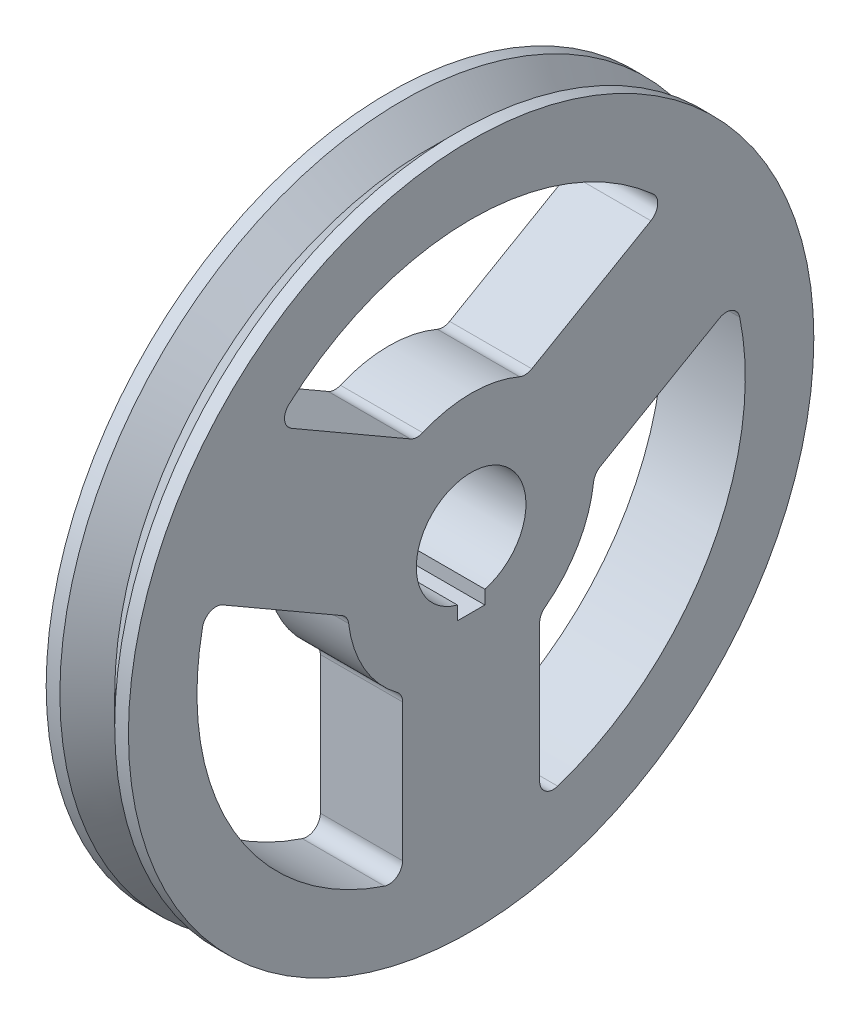
ISO-10303-21;
HEADER;
FILE_DESCRIPTION(('STEP AP214'),'2;1');
FILE_NAME('part.step','',(''),(''),'','','');
FILE_SCHEMA(('AUTOMOTIVE_DESIGN { 1 0 10303 214 1 1 1 1 }'));
ENDSEC;
DATA;
#1=APPLICATION_CONTEXT('core data for automotive mechanical design processes');
#2=APPLICATION_PROTOCOL_DEFINITION('international standard','automotive_design',2000,#1);
#3=PRODUCT_CONTEXT('',#1,'mechanical');
#4=PRODUCT('Part','Part','',(#3));
#5=PRODUCT_RELATED_PRODUCT_CATEGORY('part','',(#4));
#6=PRODUCT_DEFINITION_FORMATION('','',#4);
#7=PRODUCT_DEFINITION_CONTEXT('part definition',#1,'design');
#8=PRODUCT_DEFINITION('design','',#6,#7);
#9=PRODUCT_DEFINITION_SHAPE('','',#8);
#10=(LENGTH_UNIT() NAMED_UNIT(*) SI_UNIT(.MILLI.,.METRE.));
#11=(NAMED_UNIT(*) PLANE_ANGLE_UNIT() SI_UNIT($,.RADIAN.));
#12=(NAMED_UNIT(*) SI_UNIT($,.STERADIAN.) SOLID_ANGLE_UNIT());
#13=UNCERTAINTY_MEASURE_WITH_UNIT(LENGTH_MEASURE(1.E-05),#10,'distance_accuracy_value','');
#14=(GEOMETRIC_REPRESENTATION_CONTEXT(3) GLOBAL_UNCERTAINTY_ASSIGNED_CONTEXT((#13)) GLOBAL_UNIT_ASSIGNED_CONTEXT((#10,
#11,#12)) REPRESENTATION_CONTEXT('',''));
#15=CARTESIAN_POINT('',(0.,0.,0.));
#16=DIRECTION('',(0.,0.,1.));
#17=DIRECTION('',(1.,0.,0.));
#18=AXIS2_PLACEMENT_3D('',#15,#16,#17);
#19=CARTESIAN_POINT('',(-15.,0.,0.));
#20=DIRECTION('',(1.,0.,0.));
#21=DIRECTION('',(0.,0.,-1.));
#22=AXIS2_PLACEMENT_3D('',#19,#20,#21);
#23=PLANE('',#22);
#24=CARTESIAN_POINT('',(-15.,0.,0.));
#25=DIRECTION('',(-1.,0.,0.));
#26=DIRECTION('',(0.,0.,1.));
#27=AXIS2_PLACEMENT_3D('',#24,#25,#26);
#28=CIRCLE('',#27,125.);
#29=CARTESIAN_POINT('',(-15.,0.,125.));
#30=VERTEX_POINT('',#29);
#31=EDGE_CURVE('E49',#30,#30,#28,.T.);
#32=ORIENTED_EDGE('',*,*,#31,.T.);
#33=EDGE_LOOP('',(#32));
#34=FACE_BOUND('',#33,.T.);
#35=CARTESIAN_POINT('',(-15.,0.,0.));
#36=DIRECTION('',(-1.,0.,0.));
#37=DIRECTION('',(0.,0.,1.));
#38=AXIS2_PLACEMENT_3D('',#35,#36,#37);
#39=CIRCLE('',#38,100.);
#40=CARTESIAN_POINT('',(-15.,-94.8829283016839,31.5789473684211));
#41=VERTEX_POINT('',#40);
#42=CARTESIAN_POINT('',(-15.,20.0932935050176,97.9604999789263));
#43=VERTEX_POINT('',#42);
#44=EDGE_CURVE('E441',#41,#43,#39,.T.);
#45=ORIENTED_EDGE('',*,*,#44,.F.);
#46=CARTESIAN_POINT('',(-15.,-90.1387818865997,30.));
#47=DIRECTION('',(1.,0.,0.));
#48=DIRECTION('',(0.,0.,-1.));
#49=AXIS2_PLACEMENT_3D('',#46,#47,#48);
#50=CIRCLE('',#49,5.00000000000001);
#51=CARTESIAN_POINT('',(-15.,-90.1387818865997,25.));
#52=VERTEX_POINT('',#51);
#53=EDGE_CURVE('E336',#52,#41,#50,.F.);
#54=ORIENTED_EDGE('',*,*,#53,.F.);
#55=DIRECTION('',(0.,-1.,0.));
#56=VECTOR('',#55,1.);
#57=CARTESIAN_POINT('',(-15.,0.,25.));
#58=LINE('',#57,#56);
#59=CARTESIAN_POINT('',(-15.,-40.,25.));
#60=VERTEX_POINT('',#59);
#61=EDGE_CURVE('E334',#60,#52,#58,.T.);
#62=ORIENTED_EDGE('',*,*,#61,.F.);
#63=CARTESIAN_POINT('',(-15.,-40.,30.));
#64=DIRECTION('',(1.,0.,0.));
#65=DIRECTION('',(0.,0.,-1.));
#66=AXIS2_PLACEMENT_3D('',#63,#64,#65);
#67=CIRCLE('',#66,5.);
#68=CARTESIAN_POINT('',(-15.,-36.,27.));
#69=VERTEX_POINT('',#68);
#70=EDGE_CURVE('E332',#69,#60,#67,.F.);
#71=ORIENTED_EDGE('',*,*,#70,.F.);
#72=CARTESIAN_POINT('',(-15.,0.,0.));
#73=DIRECTION('',(-1.,0.,0.));
#74=DIRECTION('',(0.,0.,1.));
#75=AXIS2_PLACEMENT_3D('',#72,#73,#74);
#76=CIRCLE('',#75,45.);
#77=CARTESIAN_POINT('',(-15.,-5.3826859021805,44.6769145362397));
#78=VERTEX_POINT('',#77);
#79=EDGE_CURVE('E363',#69,#78,#76,.T.);
#80=ORIENTED_EDGE('',*,*,#79,.T.);
#81=CARTESIAN_POINT('',(-15.,-5.98076211353398,49.6410161513781));
#82=DIRECTION('',(1.,0.,0.));
#83=DIRECTION('',(0.,0.,-1.));
#84=AXIS2_PLACEMENT_3D('',#81,#82,#83);
#85=CIRCLE('',#84,5.00000000000096);
#86=CARTESIAN_POINT('',(-15.,-1.65063509461098,47.1410161513776));
#87=VERTEX_POINT('',#86);
#88=EDGE_CURVE('E399',#78,#87,#85,.T.);
#89=ORIENTED_EDGE('',*,*,#88,.T.);
#90=DIRECTION('',(0.,0.5,0.866025403784439));
#91=VECTOR('',#90,1.);
#92=CARTESIAN_POINT('',(-15.,-21.650635094611,12.5));
#93=LINE('',#92,#91);
#94=CARTESIAN_POINT('',(-15.,23.4187558486889,90.56247497998));
#95=VERTEX_POINT('',#94);
#96=EDGE_CURVE('E396',#87,#95,#93,.T.);
#97=ORIENTED_EDGE('',*,*,#96,.T.);
#98=CARTESIAN_POINT('',(-15.,19.0886288297667,93.06247497998));
#99=DIRECTION('',(1.,0.,0.));
#100=DIRECTION('',(0.,0.,-1.));
#101=AXIS2_PLACEMENT_3D('',#98,#99,#100);
#102=CIRCLE('',#101,5.00000000000001);
#103=EDGE_CURVE('E375',#95,#43,#102,.T.);
#104=ORIENTED_EDGE('',*,*,#103,.T.);
#105=EDGE_LOOP('',(#45,#54,#62,#71,#80,#89,#97,#104));
#106=FACE_BOUND('',#105,.T.);
#107=CARTESIAN_POINT('',(-15.,-90.1387818865997,-30.));
#108=DIRECTION('',(1.,0.,0.));
#109=DIRECTION('',(0.,0.,-1.));
#110=AXIS2_PLACEMENT_3D('',#107,#108,#109);
#111=CIRCLE('',#110,5.00000000000001);
#112=CARTESIAN_POINT('',(-15.,-90.1387818865997,-25.));
#113=VERTEX_POINT('',#112);
#114=CARTESIAN_POINT('',(-15.,-94.8829283016839,-31.5789473684211));
#115=VERTEX_POINT('',#114);
#116=EDGE_CURVE('E338',#113,#115,#111,.T.);
#117=ORIENTED_EDGE('',*,*,#116,.T.);
#118=CARTESIAN_POINT('',(-15.,20.0932935050176,-97.9604999789263));
#119=VERTEX_POINT('',#118);
#120=EDGE_CURVE('E445',#119,#115,#39,.T.);
#121=ORIENTED_EDGE('',*,*,#120,.F.);
#122=CARTESIAN_POINT('',(-15.,19.0886288297668,-93.06247497998));
#123=DIRECTION('',(1.,0.,0.));
#124=DIRECTION('',(0.,0.,-1.));
#125=AXIS2_PLACEMENT_3D('',#122,#123,#124);
#126=CIRCLE('',#125,5.00000000000001);
#127=CARTESIAN_POINT('',(-15.,23.4187558486889,-90.56247497998));
#128=VERTEX_POINT('',#127);
#129=EDGE_CURVE('E283',#128,#119,#126,.F.);
#130=ORIENTED_EDGE('',*,*,#129,.F.);
#131=DIRECTION('',(0.,0.5,-0.866025403784438));
#132=VECTOR('',#131,1.);
#133=CARTESIAN_POINT('',(-15.,-21.650635094611,-12.5));
#134=LINE('',#133,#132);
#135=CARTESIAN_POINT('',(-15.,-1.65063509461095,-47.1410161513776));
#136=VERTEX_POINT('',#135);
#137=EDGE_CURVE('E281',#136,#128,#134,.T.);
#138=ORIENTED_EDGE('',*,*,#137,.F.);
#139=CARTESIAN_POINT('',(-15.,-5.98076211353314,-49.6410161513776));
#140=DIRECTION('',(1.,0.,0.));
#141=DIRECTION('',(0.,0.,-1.));
#142=AXIS2_PLACEMENT_3D('',#139,#140,#141);
#143=CIRCLE('',#142,5.00000000000001);
#144=CARTESIAN_POINT('',(-15.,-5.38268590217982,-44.6769145362398));
#145=VERTEX_POINT('',#144);
#146=EDGE_CURVE('E260',#145,#136,#143,.F.);
#147=ORIENTED_EDGE('',*,*,#146,.F.);
#148=CARTESIAN_POINT('',(-15.,-36.,-27.));
#149=VERTEX_POINT('',#148);
#150=EDGE_CURVE('E64',#145,#149,#76,.T.);
#151=ORIENTED_EDGE('',*,*,#150,.T.);
#152=CARTESIAN_POINT('',(-15.,-40.,-30.));
#153=DIRECTION('',(1.,0.,0.));
#154=DIRECTION('',(0.,0.,-1.));
#155=AXIS2_PLACEMENT_3D('',#152,#153,#154);
#156=CIRCLE('',#155,5.);
#157=CARTESIAN_POINT('',(-15.,-40.,-25.));
#158=VERTEX_POINT('',#157);
#159=EDGE_CURVE('E311',#149,#158,#156,.T.);
#160=ORIENTED_EDGE('',*,*,#159,.T.);
#161=DIRECTION('',(0.,-1.,0.));
#162=VECTOR('',#161,1.);
#163=CARTESIAN_POINT('',(-15.,0.,-25.));
#164=LINE('',#163,#162);
#165=EDGE_CURVE('E316',#158,#113,#164,.T.);
#166=ORIENTED_EDGE('',*,*,#165,.T.);
#167=EDGE_LOOP('',(#117,#121,#130,#138,#147,#151,#160,#166));
#168=FACE_BOUND('',#167,.T.);
#169=CARTESIAN_POINT('',(-15.,41.3826859021799,17.6769145362398));
#170=VERTEX_POINT('',#169);
#171=CARTESIAN_POINT('',(-15.,41.3826859021799,-17.6769145362398));
#172=VERTEX_POINT('',#171);
#173=EDGE_CURVE('E364',#170,#172,#76,.T.);
#174=ORIENTED_EDGE('',*,*,#173,.T.);
#175=CARTESIAN_POINT('',(-15.,45.9807621135332,-19.6410161513775));
#176=DIRECTION('',(1.,0.,0.));
#177=DIRECTION('',(0.,0.,-1.));
#178=AXIS2_PLACEMENT_3D('',#175,#176,#177);
#179=CIRCLE('',#178,5.00000000000002);
#180=CARTESIAN_POINT('',(-15.,41.650635094611,-22.1410161513775));
#181=VERTEX_POINT('',#180);
#182=EDGE_CURVE('E266',#172,#181,#179,.T.);
#183=ORIENTED_EDGE('',*,*,#182,.T.);
#184=DIRECTION('',(0.,0.500000000000001,-0.866025403784438));
#185=VECTOR('',#184,1.);
#186=CARTESIAN_POINT('',(-15.,21.6506350946109,12.5));
#187=LINE('',#186,#185);
#188=CARTESIAN_POINT('',(-15.,66.7200260379109,-65.56247497998));
#189=VERTEX_POINT('',#188);
#190=EDGE_CURVE('E288',#181,#189,#187,.T.);
#191=ORIENTED_EDGE('',*,*,#190,.T.);
#192=CARTESIAN_POINT('',(-15.,71.0501530568331,-63.06247497998));
#193=DIRECTION('',(1.,0.,0.));
#194=DIRECTION('',(0.,0.,-1.));
#195=AXIS2_PLACEMENT_3D('',#192,#193,#194);
#196=CIRCLE('',#195,5.00000000000001);
#197=CARTESIAN_POINT('',(-15.,74.7896347966664,-66.3815526105052));
#198=VERTEX_POINT('',#197);
#199=EDGE_CURVE('E285',#189,#198,#196,.T.);
#200=ORIENTED_EDGE('',*,*,#199,.T.);
#201=CARTESIAN_POINT('',(-15.,74.7896347966663,66.3815526105053));
#202=VERTEX_POINT('',#201);
#203=EDGE_CURVE('E443',#202,#198,#39,.T.);
#204=ORIENTED_EDGE('',*,*,#203,.F.);
#205=CARTESIAN_POINT('',(-15.,71.050153056833,63.06247497998));
#206=DIRECTION('',(1.,0.,0.));
#207=DIRECTION('',(0.,0.,-1.));
#208=AXIS2_PLACEMENT_3D('',#205,#206,#207);
#209=CIRCLE('',#208,5.00000000000001);
#210=CARTESIAN_POINT('',(-15.,66.7200260379108,65.56247497998));
#211=VERTEX_POINT('',#210);
#212=EDGE_CURVE('E380',#211,#202,#209,.F.);
#213=ORIENTED_EDGE('',*,*,#212,.F.);
#214=DIRECTION('',(0.,0.5,0.866025403784439));
#215=VECTOR('',#214,1.);
#216=CARTESIAN_POINT('',(-15.,21.650635094611,-12.5));
#217=LINE('',#216,#215);
#218=CARTESIAN_POINT('',(-15.,41.650635094611,22.1410161513776));
#219=VERTEX_POINT('',#218);
#220=EDGE_CURVE('E404',#219,#211,#217,.T.);
#221=ORIENTED_EDGE('',*,*,#220,.F.);
#222=CARTESIAN_POINT('',(-15.,45.9807621135332,19.6410161513776));
#223=DIRECTION('',(1.,0.,0.));
#224=DIRECTION('',(0.,0.,-1.));
#225=AXIS2_PLACEMENT_3D('',#222,#223,#224);
#226=CIRCLE('',#225,5.00000000000001);
#227=EDGE_CURVE('E402',#170,#219,#226,.F.);
#228=ORIENTED_EDGE('',*,*,#227,.F.);
#229=EDGE_LOOP('',(#174,#183,#191,#200,#204,#213,#221,#228));
#230=FACE_BOUND('',#229,.T.);
#231=DIRECTION('',(0.,-1.,0.));
#232=VECTOR('',#231,1.);
#233=CARTESIAN_POINT('',(-15.,0.,5.));
#234=LINE('',#233,#232);
#235=CARTESIAN_POINT('',(-15.,-19.3649167310371,5.));
#236=VERTEX_POINT('',#235);
#237=CARTESIAN_POINT('',(-15.,-24.3649167310371,5.));
#238=VERTEX_POINT('',#237);
#239=EDGE_CURVE('E248',#236,#238,#234,.T.);
#240=ORIENTED_EDGE('',*,*,#239,.T.);
#241=DIRECTION('',(0.,0.,-1.));
#242=VECTOR('',#241,1.);
#243=CARTESIAN_POINT('',(-15.,-24.3649167310371,0.));
#244=LINE('',#243,#242);
#245=CARTESIAN_POINT('',(-15.,-24.3649167310371,-5.));
#246=VERTEX_POINT('',#245);
#247=EDGE_CURVE('E251',#238,#246,#244,.T.);
#248=ORIENTED_EDGE('',*,*,#247,.T.);
#249=DIRECTION('',(0.,-1.,0.));
#250=VECTOR('',#249,1.);
#251=CARTESIAN_POINT('',(-15.,0.,-5.));
#252=LINE('',#251,#250);
#253=CARTESIAN_POINT('',(-15.,-19.3649167310371,-5.));
#254=VERTEX_POINT('',#253);
#255=EDGE_CURVE('E240',#254,#246,#252,.T.);
#256=ORIENTED_EDGE('',*,*,#255,.F.);
#257=CARTESIAN_POINT('',(-15.,0.,0.));
#258=DIRECTION('',(-1.,0.,0.));
#259=DIRECTION('',(0.,0.,1.));
#260=AXIS2_PLACEMENT_3D('',#257,#258,#259);
#261=CIRCLE('',#260,20.);
#262=EDGE_CURVE('E372',#236,#254,#261,.T.);
#263=ORIENTED_EDGE('',*,*,#262,.F.);
#264=EDGE_LOOP('',(#240,#248,#256,#263));
#265=FACE_BOUND('',#264,.T.);
#266=ADVANCED_FACE('F41',(#34,#106,#168,#230,#265),#23,.F.);
#267=CARTESIAN_POINT('',(15.,0.,0.));
#268=DIRECTION('',(-1.,0.,0.));
#269=DIRECTION('',(0.,0.,1.));
#270=AXIS2_PLACEMENT_3D('',#267,#268,#269);
#271=PLANE('',#270);
#272=CARTESIAN_POINT('',(15.,-90.1387818865997,30.));
#273=DIRECTION('',(1.,0.,0.));
#274=DIRECTION('',(0.,0.,-1.));
#275=AXIS2_PLACEMENT_3D('',#272,#273,#274);
#276=CIRCLE('',#275,5.00000000000001);
#277=CARTESIAN_POINT('',(15.,-90.1387818865997,25.));
#278=VERTEX_POINT('',#277);
#279=CARTESIAN_POINT('',(15.,-94.8829283016839,31.5789473684211));
#280=VERTEX_POINT('',#279);
#281=EDGE_CURVE('E320',#278,#280,#276,.F.);
#282=ORIENTED_EDGE('',*,*,#281,.T.);
#283=CARTESIAN_POINT('',(15.,0.,0.));
#284=DIRECTION('',(-1.,0.,0.));
#285=DIRECTION('',(0.,0.,1.));
#286=AXIS2_PLACEMENT_3D('',#283,#284,#285);
#287=CIRCLE('',#286,100.);
#288=CARTESIAN_POINT('',(15.,20.0932935050176,97.9604999789263));
#289=VERTEX_POINT('',#288);
#290=EDGE_CURVE('E437',#280,#289,#287,.T.);
#291=ORIENTED_EDGE('',*,*,#290,.T.);
#292=CARTESIAN_POINT('',(15.,19.0886288297667,93.06247497998));
#293=DIRECTION('',(1.,0.,0.));
#294=DIRECTION('',(0.,0.,-1.));
#295=AXIS2_PLACEMENT_3D('',#292,#293,#294);
#296=CIRCLE('',#295,5.00000000000001);
#297=CARTESIAN_POINT('',(15.,23.4187558486889,90.56247497998));
#298=VERTEX_POINT('',#297);
#299=EDGE_CURVE('E376',#298,#289,#296,.T.);
#300=ORIENTED_EDGE('',*,*,#299,.F.);
#301=DIRECTION('',(0.,0.5,0.866025403784439));
#302=VECTOR('',#301,1.);
#303=CARTESIAN_POINT('',(15.,-21.650635094611,12.5));
#304=LINE('',#303,#302);
#305=CARTESIAN_POINT('',(15.,-1.65063509461098,47.1410161513776));
#306=VERTEX_POINT('',#305);
#307=EDGE_CURVE('E379',#306,#298,#304,.T.);
#308=ORIENTED_EDGE('',*,*,#307,.F.);
#309=CARTESIAN_POINT('',(15.,-5.98076211353398,49.6410161513781));
#310=DIRECTION('',(1.,0.,0.));
#311=DIRECTION('',(0.,0.,-1.));
#312=AXIS2_PLACEMENT_3D('',#309,#310,#311);
#313=CIRCLE('',#312,5.00000000000096);
#314=CARTESIAN_POINT('',(15.,-5.3826859021805,44.6769145362397));
#315=VERTEX_POINT('',#314);
#316=EDGE_CURVE('E383',#315,#306,#313,.T.);
#317=ORIENTED_EDGE('',*,*,#316,.F.);
#318=CARTESIAN_POINT('',(15.,0.,0.));
#319=DIRECTION('',(-1.,0.,0.));
#320=DIRECTION('',(0.,0.,1.));
#321=AXIS2_PLACEMENT_3D('',#318,#319,#320);
#322=CIRCLE('',#321,45.);
#323=CARTESIAN_POINT('',(15.,-36.,27.));
#324=VERTEX_POINT('',#323);
#325=EDGE_CURVE('E367',#324,#315,#322,.T.);
#326=ORIENTED_EDGE('',*,*,#325,.F.);
#327=CARTESIAN_POINT('',(15.,-40.,30.));
#328=DIRECTION('',(1.,0.,0.));
#329=DIRECTION('',(0.,0.,-1.));
#330=AXIS2_PLACEMENT_3D('',#327,#328,#329);
#331=CIRCLE('',#330,5.);
#332=CARTESIAN_POINT('',(15.,-40.,25.));
#333=VERTEX_POINT('',#332);
#334=EDGE_CURVE('E315',#324,#333,#331,.F.);
#335=ORIENTED_EDGE('',*,*,#334,.T.);
#336=DIRECTION('',(0.,-1.,0.));
#337=VECTOR('',#336,1.);
#338=CARTESIAN_POINT('',(15.,0.,25.));
#339=LINE('',#338,#337);
#340=EDGE_CURVE('E318',#333,#278,#339,.T.);
#341=ORIENTED_EDGE('',*,*,#340,.T.);
#342=EDGE_LOOP('',(#282,#291,#300,#308,#317,#326,#335,#341));
#343=FACE_BOUND('',#342,.T.);
#344=CARTESIAN_POINT('',(15.,0.,0.));
#345=DIRECTION('',(-1.,0.,0.));
#346=DIRECTION('',(0.,0.,1.));
#347=AXIS2_PLACEMENT_3D('',#344,#345,#346);
#348=CIRCLE('',#347,125.);
#349=CARTESIAN_POINT('',(15.,0.,125.));
#350=VERTEX_POINT('',#349);
#351=EDGE_CURVE('E434',#350,#350,#348,.T.);
#352=ORIENTED_EDGE('',*,*,#351,.F.);
#353=EDGE_LOOP('',(#352));
#354=FACE_BOUND('',#353,.T.);
#355=CARTESIAN_POINT('',(15.,-5.38268590217982,-44.6769145362398));
#356=VERTEX_POINT('',#355);
#357=CARTESIAN_POINT('',(15.,-36.,-27.));
#358=VERTEX_POINT('',#357);
#359=EDGE_CURVE('E370',#356,#358,#322,.T.);
#360=ORIENTED_EDGE('',*,*,#359,.F.);
#361=CARTESIAN_POINT('',(15.,-5.98076211353314,-49.6410161513776));
#362=DIRECTION('',(1.,0.,0.));
#363=DIRECTION('',(0.,0.,-1.));
#364=AXIS2_PLACEMENT_3D('',#361,#362,#363);
#365=CIRCLE('',#364,5.00000000000001);
#366=CARTESIAN_POINT('',(15.,-1.65063509461095,-47.1410161513776));
#367=VERTEX_POINT('',#366);
#368=EDGE_CURVE('E263',#356,#367,#365,.F.);
#369=ORIENTED_EDGE('',*,*,#368,.T.);
#370=DIRECTION('',(0.,0.5,-0.866025403784438));
#371=VECTOR('',#370,1.);
#372=CARTESIAN_POINT('',(15.,-21.650635094611,-12.5));
#373=LINE('',#372,#371);
#374=CARTESIAN_POINT('',(15.,23.4187558486889,-90.56247497998));
#375=VERTEX_POINT('',#374);
#376=EDGE_CURVE('E265',#367,#375,#373,.T.);
#377=ORIENTED_EDGE('',*,*,#376,.T.);
#378=CARTESIAN_POINT('',(15.,19.0886288297668,-93.06247497998));
#379=DIRECTION('',(1.,0.,0.));
#380=DIRECTION('',(0.,0.,-1.));
#381=AXIS2_PLACEMENT_3D('',#378,#379,#380);
#382=CIRCLE('',#381,5.00000000000001);
#383=CARTESIAN_POINT('',(15.,20.0932935050176,-97.9604999789263));
#384=VERTEX_POINT('',#383);
#385=EDGE_CURVE('E268',#375,#384,#382,.F.);
#386=ORIENTED_EDGE('',*,*,#385,.T.);
#387=CARTESIAN_POINT('',(15.,-94.8829283016839,-31.5789473684211));
#388=VERTEX_POINT('',#387);
#389=EDGE_CURVE('E442',#384,#388,#287,.T.);
#390=ORIENTED_EDGE('',*,*,#389,.T.);
#391=CARTESIAN_POINT('',(15.,-90.1387818865997,-30.));
#392=DIRECTION('',(1.,0.,0.));
#393=DIRECTION('',(0.,0.,-1.));
#394=AXIS2_PLACEMENT_3D('',#391,#392,#393);
#395=CIRCLE('',#394,5.00000000000001);
#396=CARTESIAN_POINT('',(15.,-90.1387818865997,-25.));
#397=VERTEX_POINT('',#396);
#398=EDGE_CURVE('E323',#397,#388,#395,.T.);
#399=ORIENTED_EDGE('',*,*,#398,.F.);
#400=DIRECTION('',(0.,-1.,0.));
#401=VECTOR('',#400,1.);
#402=CARTESIAN_POINT('',(15.,0.,-25.));
#403=LINE('',#402,#401);
#404=CARTESIAN_POINT('',(15.,-40.,-25.));
#405=VERTEX_POINT('',#404);
#406=EDGE_CURVE('E326',#405,#397,#403,.T.);
#407=ORIENTED_EDGE('',*,*,#406,.F.);
#408=CARTESIAN_POINT('',(15.,-40.,-30.));
#409=DIRECTION('',(1.,0.,0.));
#410=DIRECTION('',(0.,0.,-1.));
#411=AXIS2_PLACEMENT_3D('',#408,#409,#410);
#412=CIRCLE('',#411,5.);
#413=EDGE_CURVE('E312',#358,#405,#412,.T.);
#414=ORIENTED_EDGE('',*,*,#413,.F.);
#415=EDGE_LOOP('',(#360,#369,#377,#386,#390,#399,#407,#414));
#416=FACE_BOUND('',#415,.T.);
#417=CARTESIAN_POINT('',(15.,45.9807621135332,-19.6410161513775));
#418=DIRECTION('',(1.,0.,0.));
#419=DIRECTION('',(0.,0.,-1.));
#420=AXIS2_PLACEMENT_3D('',#417,#418,#419);
#421=CIRCLE('',#420,5.00000000000002);
#422=CARTESIAN_POINT('',(15.,41.3826859021799,-17.6769145362398));
#423=VERTEX_POINT('',#422);
#424=CARTESIAN_POINT('',(15.,41.650635094611,-22.1410161513775));
#425=VERTEX_POINT('',#424);
#426=EDGE_CURVE('E276',#423,#425,#421,.T.);
#427=ORIENTED_EDGE('',*,*,#426,.F.);
#428=CARTESIAN_POINT('',(15.,41.3826859021798,17.6769145362398));
#429=VERTEX_POINT('',#428);
#430=EDGE_CURVE('E368',#429,#423,#322,.T.);
#431=ORIENTED_EDGE('',*,*,#430,.F.);
#432=CARTESIAN_POINT('',(15.,45.9807621135332,19.6410161513776));
#433=DIRECTION('',(1.,0.,0.));
#434=DIRECTION('',(0.,0.,-1.));
#435=AXIS2_PLACEMENT_3D('',#432,#433,#434);
#436=CIRCLE('',#435,5.00000000000001);
#437=CARTESIAN_POINT('',(15.,41.650635094611,22.1410161513776));
#438=VERTEX_POINT('',#437);
#439=EDGE_CURVE('E386',#429,#438,#436,.F.);
#440=ORIENTED_EDGE('',*,*,#439,.T.);
#441=DIRECTION('',(0.,0.5,0.866025403784439));
#442=VECTOR('',#441,1.);
#443=CARTESIAN_POINT('',(15.,21.650635094611,-12.5));
#444=LINE('',#443,#442);
#445=CARTESIAN_POINT('',(15.,66.7200260379108,65.56247497998));
#446=VERTEX_POINT('',#445);
#447=EDGE_CURVE('E388',#438,#446,#444,.T.);
#448=ORIENTED_EDGE('',*,*,#447,.T.);
#449=CARTESIAN_POINT('',(15.,71.050153056833,63.06247497998));
#450=DIRECTION('',(1.,0.,0.));
#451=DIRECTION('',(0.,0.,-1.));
#452=AXIS2_PLACEMENT_3D('',#449,#450,#451);
#453=CIRCLE('',#452,5.00000000000001);
#454=CARTESIAN_POINT('',(15.,74.7896347966663,66.3815526105053));
#455=VERTEX_POINT('',#454);
#456=EDGE_CURVE('E390',#446,#455,#453,.F.);
#457=ORIENTED_EDGE('',*,*,#456,.T.);
#458=CARTESIAN_POINT('',(15.,74.7896347966664,-66.3815526105052));
#459=VERTEX_POINT('',#458);
#460=EDGE_CURVE('E438',#455,#459,#287,.T.);
#461=ORIENTED_EDGE('',*,*,#460,.T.);
#462=CARTESIAN_POINT('',(15.,71.0501530568331,-63.06247497998));
#463=DIRECTION('',(1.,0.,0.));
#464=DIRECTION('',(0.,0.,-1.));
#465=AXIS2_PLACEMENT_3D('',#462,#463,#464);
#466=CIRCLE('',#465,5.00000000000001);
#467=CARTESIAN_POINT('',(15.,66.7200260379109,-65.56247497998));
#468=VERTEX_POINT('',#467);
#469=EDGE_CURVE('E271',#468,#459,#466,.T.);
#470=ORIENTED_EDGE('',*,*,#469,.F.);
#471=DIRECTION('',(0.,0.500000000000001,-0.866025403784438));
#472=VECTOR('',#471,1.);
#473=CARTESIAN_POINT('',(15.,21.6506350946109,12.5));
#474=LINE('',#473,#472);
#475=EDGE_CURVE('E273',#425,#468,#474,.T.);
#476=ORIENTED_EDGE('',*,*,#475,.F.);
#477=EDGE_LOOP('',(#427,#431,#440,#448,#457,#461,#470,#476));
#478=FACE_BOUND('',#477,.T.);
#479=DIRECTION('',(0.,-1.,0.));
#480=VECTOR('',#479,1.);
#481=CARTESIAN_POINT('',(15.,0.,5.));
#482=LINE('',#481,#480);
#483=CARTESIAN_POINT('',(15.,-19.3649167310371,5.));
#484=VERTEX_POINT('',#483);
#485=CARTESIAN_POINT('',(15.,-24.3649167310371,5.));
#486=VERTEX_POINT('',#485);
#487=EDGE_CURVE('E236',#484,#486,#482,.T.);
#488=ORIENTED_EDGE('',*,*,#487,.F.);
#489=CARTESIAN_POINT('',(15.,0.,0.));
#490=DIRECTION('',(-1.,0.,0.));
#491=DIRECTION('',(0.,0.,1.));
#492=AXIS2_PLACEMENT_3D('',#489,#490,#491);
#493=CIRCLE('',#492,20.);
#494=CARTESIAN_POINT('',(15.,-19.3649167310371,-5.));
#495=VERTEX_POINT('',#494);
#496=EDGE_CURVE('E247',#484,#495,#493,.T.);
#497=ORIENTED_EDGE('',*,*,#496,.T.);
#498=DIRECTION('',(0.,-1.,0.));
#499=VECTOR('',#498,1.);
#500=CARTESIAN_POINT('',(15.,0.,-5.));
#501=LINE('',#500,#499);
#502=CARTESIAN_POINT('',(15.,-24.3649167310371,-5.));
#503=VERTEX_POINT('',#502);
#504=EDGE_CURVE('E56',#495,#503,#501,.T.);
#505=ORIENTED_EDGE('',*,*,#504,.T.);
#506=DIRECTION('',(0.,0.,-1.));
#507=VECTOR('',#506,1.);
#508=CARTESIAN_POINT('',(15.,-24.3649167310371,0.));
#509=LINE('',#508,#507);
#510=EDGE_CURVE('E228',#486,#503,#509,.T.);
#511=ORIENTED_EDGE('',*,*,#510,.F.);
#512=EDGE_LOOP('',(#488,#497,#505,#511));
#513=FACE_BOUND('',#512,.T.);
#514=ADVANCED_FACE('F245',(#343,#354,#416,#478,#513),#271,.F.);
#515=CARTESIAN_POINT('',(0.,0.,0.));
#516=DIRECTION('',(-1.,0.,0.));
#517=DIRECTION('',(0.,0.,1.));
#518=AXIS2_PLACEMENT_3D('',#515,#516,#517);
#519=CYLINDRICAL_SURFACE('',#518,20.);
#520=DIRECTION('',(-1.,0.,0.));
#521=VECTOR('',#520,1.);
#522=CARTESIAN_POINT('',(15.,-19.3649167310371,5.));
#523=LINE('',#522,#521);
#524=EDGE_CURVE('E257',#484,#236,#523,.T.);
#525=ORIENTED_EDGE('',*,*,#524,.T.);
#526=ORIENTED_EDGE('',*,*,#262,.T.);
#527=DIRECTION('',(-1.,0.,0.));
#528=VECTOR('',#527,1.);
#529=CARTESIAN_POINT('',(15.,-19.3649167310371,-5.));
#530=LINE('',#529,#528);
#531=EDGE_CURVE('E242',#495,#254,#530,.T.);
#532=ORIENTED_EDGE('',*,*,#531,.F.);
#533=ORIENTED_EDGE('',*,*,#496,.F.);
#534=EDGE_LOOP('',(#525,#526,#532,#533));
#535=FACE_BOUND('',#534,.T.);
#536=ADVANCED_FACE('F476',(#535),#519,.F.);
#537=CARTESIAN_POINT('',(0.,0.,0.));
#538=DIRECTION('',(-1.,0.,0.));
#539=DIRECTION('',(0.,0.,1.));
#540=AXIS2_PLACEMENT_3D('',#537,#538,#539);
#541=CYLINDRICAL_SURFACE('',#540,100.);
#542=DIRECTION('',(-1.,0.,0.));
#543=VECTOR('',#542,1.);
#544=CARTESIAN_POINT('',(15.,74.7896347966664,-66.3815526105052));
#545=LINE('',#544,#543);
#546=EDGE_CURVE('E298',#459,#198,#545,.T.);
#547=ORIENTED_EDGE('',*,*,#546,.F.);
#548=ORIENTED_EDGE('',*,*,#460,.F.);
#549=DIRECTION('',(-1.,0.,0.));
#550=VECTOR('',#549,1.);
#551=CARTESIAN_POINT('',(15.,74.7896347966663,66.3815526105053));
#552=LINE('',#551,#550);
#553=EDGE_CURVE('E393',#455,#202,#552,.T.);
#554=ORIENTED_EDGE('',*,*,#553,.T.);
#555=ORIENTED_EDGE('',*,*,#203,.T.);
#556=EDGE_LOOP('',(#547,#548,#554,#555));
#557=FACE_BOUND('',#556,.T.);
#558=ADVANCED_FACE('F510',(#557),#541,.F.);
#559=CARTESIAN_POINT('',(0.,0.,0.));
#560=DIRECTION('',(-1.,0.,0.));
#561=DIRECTION('',(0.,0.,1.));
#562=AXIS2_PLACEMENT_3D('',#559,#560,#561);
#563=CYLINDRICAL_SURFACE('',#562,45.);
#564=ORIENTED_EDGE('',*,*,#430,.T.);
#565=DIRECTION('',(-1.,0.,0.));
#566=VECTOR('',#565,1.);
#567=CARTESIAN_POINT('',(15.,41.3826859021799,-17.6769145362398));
#568=LINE('',#567,#566);
#569=EDGE_CURVE('E279',#423,#172,#568,.T.);
#570=ORIENTED_EDGE('',*,*,#569,.T.);
#571=ORIENTED_EDGE('',*,*,#173,.F.);
#572=DIRECTION('',(-1.,0.,0.));
#573=VECTOR('',#572,1.);
#574=CARTESIAN_POINT('',(15.,41.3826859021799,17.6769145362398));
#575=LINE('',#574,#573);
#576=EDGE_CURVE('E415',#429,#170,#575,.T.);
#577=ORIENTED_EDGE('',*,*,#576,.F.);
#578=EDGE_LOOP('',(#564,#570,#571,#577));
#579=FACE_BOUND('',#578,.T.);
#580=ADVANCED_FACE('F492',(#579),#563,.T.);
#581=ORIENTED_EDGE('',*,*,#389,.F.);
#582=DIRECTION('',(-1.,0.,0.));
#583=VECTOR('',#582,1.);
#584=CARTESIAN_POINT('',(15.,20.0932935050176,-97.9604999789263));
#585=LINE('',#584,#583);
#586=EDGE_CURVE('E300',#384,#119,#585,.T.);
#587=ORIENTED_EDGE('',*,*,#586,.T.);
#588=ORIENTED_EDGE('',*,*,#120,.T.);
#589=DIRECTION('',(-1.,0.,0.));
#590=VECTOR('',#589,1.);
#591=CARTESIAN_POINT('',(15.,-94.8829283016839,-31.5789473684211));
#592=LINE('',#591,#590);
#593=EDGE_CURVE('E346',#388,#115,#592,.T.);
#594=ORIENTED_EDGE('',*,*,#593,.F.);
#595=EDGE_LOOP('',(#581,#587,#588,#594));
#596=FACE_BOUND('',#595,.T.);
#597=ADVANCED_FACE('F535',(#596),#541,.F.);
#598=DIRECTION('',(-1.,0.,0.));
#599=VECTOR('',#598,1.);
#600=CARTESIAN_POINT('',(15.,-5.38268590217982,-44.6769145362398));
#601=LINE('',#600,#599);
#602=EDGE_CURVE('E309',#356,#145,#601,.T.);
#603=ORIENTED_EDGE('',*,*,#602,.F.);
#604=ORIENTED_EDGE('',*,*,#359,.T.);
#605=DIRECTION('',(-1.,0.,0.));
#606=VECTOR('',#605,1.);
#607=CARTESIAN_POINT('',(15.,-36.,-27.));
#608=LINE('',#607,#606);
#609=EDGE_CURVE('E361',#358,#149,#608,.T.);
#610=ORIENTED_EDGE('',*,*,#609,.T.);
#611=ORIENTED_EDGE('',*,*,#150,.F.);
#612=EDGE_LOOP('',(#603,#604,#610,#611));
#613=FACE_BOUND('',#612,.T.);
#614=ADVANCED_FACE('F533',(#613),#563,.T.);
#615=ORIENTED_EDGE('',*,*,#290,.F.);
#616=DIRECTION('',(-1.,0.,0.));
#617=VECTOR('',#616,1.);
#618=CARTESIAN_POINT('',(15.,-94.8829283016839,31.5789473684211));
#619=LINE('',#618,#617);
#620=EDGE_CURVE('E349',#280,#41,#619,.T.);
#621=ORIENTED_EDGE('',*,*,#620,.T.);
#622=ORIENTED_EDGE('',*,*,#44,.T.);
#623=DIRECTION('',(-1.,0.,0.));
#624=VECTOR('',#623,1.);
#625=CARTESIAN_POINT('',(15.,20.0932935050176,97.9604999789263));
#626=LINE('',#625,#624);
#627=EDGE_CURVE('E425',#289,#43,#626,.T.);
#628=ORIENTED_EDGE('',*,*,#627,.F.);
#629=EDGE_LOOP('',(#615,#621,#622,#628));
#630=FACE_BOUND('',#629,.T.);
#631=ADVANCED_FACE('F459',(#630),#541,.F.);
#632=CARTESIAN_POINT('',(0.,0.,0.));
#633=DIRECTION('',(-1.,0.,0.));
#634=DIRECTION('',(0.,0.,1.));
#635=AXIS2_PLACEMENT_3D('',#632,#633,#634);
#636=CONICAL_SURFACE('',#635,115.,0.785398163397449);
#637=CARTESIAN_POINT('',(-9.99999999999998,0.,0.));
#638=DIRECTION('',(-1.,0.,0.));
#639=DIRECTION('',(0.,0.,1.));
#640=AXIS2_PLACEMENT_3D('',#637,#638,#639);
#641=CIRCLE('',#640,125.);
#642=CARTESIAN_POINT('',(-9.99999999999998,0.,125.));
#643=VERTEX_POINT('',#642);
#644=EDGE_CURVE('E11',#643,#643,#641,.T.);
#645=ORIENTED_EDGE('',*,*,#644,.F.);
#646=EDGE_LOOP('',(#645));
#647=FACE_BOUND('',#646,.T.);
#648=CARTESIAN_POINT('',(0.,0.,0.));
#649=DIRECTION('',(-1.,0.,0.));
#650=DIRECTION('',(0.,0.,1.));
#651=AXIS2_PLACEMENT_3D('',#648,#649,#650);
#652=CIRCLE('',#651,115.);
#653=CARTESIAN_POINT('',(0.,0.,115.));
#654=VERTEX_POINT('',#653);
#655=EDGE_CURVE('E428',#654,#654,#652,.T.);
#656=ORIENTED_EDGE('',*,*,#655,.T.);
#657=EDGE_LOOP('',(#656));
#658=FACE_BOUND('',#657,.T.);
#659=ADVANCED_FACE('F43',(#647,#658),#636,.T.);
#660=CARTESIAN_POINT('',(0.,0.,0.));
#661=DIRECTION('',(-1.,0.,0.));
#662=DIRECTION('',(0.,0.,1.));
#663=AXIS2_PLACEMENT_3D('',#660,#661,#662);
#664=CYLINDRICAL_SURFACE('',#663,125.);
#665=ORIENTED_EDGE('',*,*,#31,.F.);
#666=EDGE_LOOP('',(#665));
#667=FACE_BOUND('',#666,.T.);
#668=ORIENTED_EDGE('',*,*,#644,.T.);
#669=EDGE_LOOP('',(#668));
#670=FACE_BOUND('',#669,.T.);
#671=ADVANCED_FACE('F451',(#667,#670),#664,.T.);
#672=CARTESIAN_POINT('',(0.,0.,0.));
#673=DIRECTION('',(-1.,0.,0.));
#674=DIRECTION('',(0.,0.,1.));
#675=AXIS2_PLACEMENT_3D('',#672,#673,#674);
#676=CYLINDRICAL_SURFACE('',#675,125.);
#677=CARTESIAN_POINT('',(10.,0.,0.));
#678=DIRECTION('',(-1.,0.,0.));
#679=DIRECTION('',(0.,0.,1.));
#680=AXIS2_PLACEMENT_3D('',#677,#678,#679);
#681=CIRCLE('',#680,125.);
#682=CARTESIAN_POINT('',(10.,0.,125.));
#683=VERTEX_POINT('',#682);
#684=EDGE_CURVE('E431',#683,#683,#681,.T.);
#685=ORIENTED_EDGE('',*,*,#684,.F.);
#686=EDGE_LOOP('',(#685));
#687=FACE_BOUND('',#686,.T.);
#688=ORIENTED_EDGE('',*,*,#351,.T.);
#689=EDGE_LOOP('',(#688));
#690=FACE_BOUND('',#689,.T.);
#691=ADVANCED_FACE('F454',(#687,#690),#676,.T.);
#692=CARTESIAN_POINT('',(10.,0.,0.));
#693=DIRECTION('',(1.,0.,0.));
#694=DIRECTION('',(0.,0.,-1.));
#695=AXIS2_PLACEMENT_3D('',#692,#693,#694);
#696=CONICAL_SURFACE('',#695,125.,0.785398163397447);
#697=ORIENTED_EDGE('',*,*,#655,.F.);
#698=EDGE_LOOP('',(#697));
#699=FACE_BOUND('',#698,.T.);
#700=ORIENTED_EDGE('',*,*,#684,.T.);
#701=EDGE_LOOP('',(#700));
#702=FACE_BOUND('',#701,.T.);
#703=ADVANCED_FACE('F462',(#699,#702),#696,.T.);
#704=CARTESIAN_POINT('',(15.,19.0886288297667,93.06247497998));
#705=DIRECTION('',(-1.,0.,0.));
#706=DIRECTION('',(0.,0.,1.));
#707=AXIS2_PLACEMENT_3D('',#704,#705,#706);
#708=CYLINDRICAL_SURFACE('',#707,5.00000000000001);
#709=ORIENTED_EDGE('',*,*,#103,.F.);
#710=DIRECTION('',(-1.,0.,0.));
#711=VECTOR('',#710,1.);
#712=CARTESIAN_POINT('',(15.,23.4187558486889,90.56247497998));
#713=LINE('',#712,#711);
#714=EDGE_CURVE('E423',#298,#95,#713,.T.);
#715=ORIENTED_EDGE('',*,*,#714,.F.);
#716=ORIENTED_EDGE('',*,*,#299,.T.);
#717=ORIENTED_EDGE('',*,*,#627,.T.);
#718=EDGE_LOOP('',(#709,#715,#716,#717));
#719=FACE_BOUND('',#718,.T.);
#720=ADVANCED_FACE('F465',(#719),#708,.F.);
#721=CARTESIAN_POINT('',(15.,-21.650635094611,12.5));
#722=DIRECTION('',(0.,-0.866025403784439,0.5));
#723=DIRECTION('',(0.,-0.5,-0.866025403784439));
#724=AXIS2_PLACEMENT_3D('',#721,#722,#723);
#725=PLANE('',#724);
#726=ORIENTED_EDGE('',*,*,#96,.F.);
#727=DIRECTION('',(-1.,0.,0.));
#728=VECTOR('',#727,1.);
#729=CARTESIAN_POINT('',(15.,-1.65063509461098,47.1410161513776));
#730=LINE('',#729,#728);
#731=EDGE_CURVE('E421',#306,#87,#730,.T.);
#732=ORIENTED_EDGE('',*,*,#731,.F.);
#733=ORIENTED_EDGE('',*,*,#307,.T.);
#734=ORIENTED_EDGE('',*,*,#714,.T.);
#735=EDGE_LOOP('',(#726,#732,#733,#734));
#736=FACE_BOUND('',#735,.T.);
#737=ADVANCED_FACE('F539',(#736),#725,.T.);
#738=CARTESIAN_POINT('',(15.,-5.98076211353398,49.6410161513781));
#739=DIRECTION('',(-1.,0.,0.));
#740=DIRECTION('',(0.,0.,1.));
#741=AXIS2_PLACEMENT_3D('',#738,#739,#740);
#742=CYLINDRICAL_SURFACE('',#741,5.00000000000096);
#743=ORIENTED_EDGE('',*,*,#88,.F.);
#744=DIRECTION('',(-1.,0.,0.));
#745=VECTOR('',#744,1.);
#746=CARTESIAN_POINT('',(15.,-5.38268590218045,44.6769145362394));
#747=LINE('',#746,#745);
#748=EDGE_CURVE('E418',#315,#78,#747,.T.);
#749=ORIENTED_EDGE('',*,*,#748,.F.);
#750=ORIENTED_EDGE('',*,*,#316,.T.);
#751=ORIENTED_EDGE('',*,*,#731,.T.);
#752=EDGE_LOOP('',(#743,#749,#750,#751));
#753=FACE_BOUND('',#752,.T.);
#754=ADVANCED_FACE('F543',(#753),#742,.F.);
#755=CARTESIAN_POINT('',(15.,45.9807621135332,19.6410161513776));
#756=DIRECTION('',(-1.,0.,0.));
#757=DIRECTION('',(0.,0.,1.));
#758=AXIS2_PLACEMENT_3D('',#755,#756,#757);
#759=CYLINDRICAL_SURFACE('',#758,5.00000000000001);
#760=ORIENTED_EDGE('',*,*,#227,.T.);
#761=DIRECTION('',(-1.,0.,0.));
#762=VECTOR('',#761,1.);
#763=CARTESIAN_POINT('',(15.,41.650635094611,22.1410161513776));
#764=LINE('',#763,#762);
#765=EDGE_CURVE('E412',#438,#219,#764,.T.);
#766=ORIENTED_EDGE('',*,*,#765,.F.);
#767=ORIENTED_EDGE('',*,*,#439,.F.);
#768=ORIENTED_EDGE('',*,*,#576,.T.);
#769=EDGE_LOOP('',(#760,#766,#767,#768));
#770=FACE_BOUND('',#769,.T.);
#771=ADVANCED_FACE('F500',(#770),#759,.F.);
#772=CARTESIAN_POINT('',(15.,21.650635094611,-12.5));
#773=DIRECTION('',(0.,-0.866025403784439,0.5));
#774=DIRECTION('',(0.,-0.5,-0.866025403784439));
#775=AXIS2_PLACEMENT_3D('',#772,#773,#774);
#776=PLANE('',#775);
#777=ORIENTED_EDGE('',*,*,#220,.T.);
#778=DIRECTION('',(-1.,0.,0.));
#779=VECTOR('',#778,1.);
#780=CARTESIAN_POINT('',(15.,66.7200260379108,65.56247497998));
#781=LINE('',#780,#779);
#782=EDGE_CURVE('E409',#446,#211,#781,.T.);
#783=ORIENTED_EDGE('',*,*,#782,.F.);
#784=ORIENTED_EDGE('',*,*,#447,.F.);
#785=ORIENTED_EDGE('',*,*,#765,.T.);
#786=EDGE_LOOP('',(#777,#783,#784,#785));
#787=FACE_BOUND('',#786,.T.);
#788=ADVANCED_FACE('F503',(#787),#776,.F.);
#789=CARTESIAN_POINT('',(15.,71.050153056833,63.06247497998));
#790=DIRECTION('',(-1.,0.,0.));
#791=DIRECTION('',(0.,0.,1.));
#792=AXIS2_PLACEMENT_3D('',#789,#790,#791);
#793=CYLINDRICAL_SURFACE('',#792,5.00000000000001);
#794=ORIENTED_EDGE('',*,*,#212,.T.);
#795=ORIENTED_EDGE('',*,*,#553,.F.);
#796=ORIENTED_EDGE('',*,*,#456,.F.);
#797=ORIENTED_EDGE('',*,*,#782,.T.);
#798=EDGE_LOOP('',(#794,#795,#796,#797));
#799=FACE_BOUND('',#798,.T.);
#800=ADVANCED_FACE('F552',(#799),#793,.F.);
#801=DIRECTION('',(-1.,0.,0.));
#802=VECTOR('',#801,1.);
#803=CARTESIAN_POINT('',(15.,-36.,27.));
#804=LINE('',#803,#802);
#805=EDGE_CURVE('E358',#324,#69,#804,.T.);
#806=ORIENTED_EDGE('',*,*,#805,.F.);
#807=ORIENTED_EDGE('',*,*,#325,.T.);
#808=ORIENTED_EDGE('',*,*,#748,.T.);
#809=ORIENTED_EDGE('',*,*,#79,.F.);
#810=EDGE_LOOP('',(#806,#807,#808,#809));
#811=FACE_BOUND('',#810,.T.);
#812=ADVANCED_FACE('F555',(#811),#563,.T.);
#813=CARTESIAN_POINT('',(15.,-40.,-30.));
#814=DIRECTION('',(-1.,0.,0.));
#815=DIRECTION('',(0.,0.,1.));
#816=AXIS2_PLACEMENT_3D('',#813,#814,#815);
#817=CYLINDRICAL_SURFACE('',#816,5.);
#818=ORIENTED_EDGE('',*,*,#159,.F.);
#819=ORIENTED_EDGE('',*,*,#609,.F.);
#820=ORIENTED_EDGE('',*,*,#413,.T.);
#821=DIRECTION('',(-1.,0.,0.));
#822=VECTOR('',#821,1.);
#823=CARTESIAN_POINT('',(15.,-40.,-25.));
#824=LINE('',#823,#822);
#825=EDGE_CURVE('E329',#405,#158,#824,.T.);
#826=ORIENTED_EDGE('',*,*,#825,.T.);
#827=EDGE_LOOP('',(#818,#819,#820,#826));
#828=FACE_BOUND('',#827,.T.);
#829=ADVANCED_FACE('F561',(#828),#817,.F.);
#830=CARTESIAN_POINT('',(15.,-40.,30.));
#831=DIRECTION('',(-1.,0.,0.));
#832=DIRECTION('',(0.,0.,1.));
#833=AXIS2_PLACEMENT_3D('',#830,#831,#832);
#834=CYLINDRICAL_SURFACE('',#833,5.);
#835=ORIENTED_EDGE('',*,*,#70,.T.);
#836=DIRECTION('',(-1.,0.,0.));
#837=VECTOR('',#836,1.);
#838=CARTESIAN_POINT('',(15.,-40.,25.));
#839=LINE('',#838,#837);
#840=EDGE_CURVE('E355',#333,#60,#839,.T.);
#841=ORIENTED_EDGE('',*,*,#840,.F.);
#842=ORIENTED_EDGE('',*,*,#334,.F.);
#843=ORIENTED_EDGE('',*,*,#805,.T.);
#844=EDGE_LOOP('',(#835,#841,#842,#843));
#845=FACE_BOUND('',#844,.T.);
#846=ADVANCED_FACE('F565',(#845),#834,.F.);
#847=CARTESIAN_POINT('',(15.,0.,25.));
#848=DIRECTION('',(0.,0.,-1.));
#849=DIRECTION('',(-1.,0.,0.));
#850=AXIS2_PLACEMENT_3D('',#847,#848,#849);
#851=PLANE('',#850);
#852=ORIENTED_EDGE('',*,*,#61,.T.);
#853=DIRECTION('',(-1.,0.,0.));
#854=VECTOR('',#853,1.);
#855=CARTESIAN_POINT('',(15.,-90.1387818865997,25.));
#856=LINE('',#855,#854);
#857=EDGE_CURVE('E352',#278,#52,#856,.T.);
#858=ORIENTED_EDGE('',*,*,#857,.F.);
#859=ORIENTED_EDGE('',*,*,#340,.F.);
#860=ORIENTED_EDGE('',*,*,#840,.T.);
#861=EDGE_LOOP('',(#852,#858,#859,#860));
#862=FACE_BOUND('',#861,.T.);
#863=ADVANCED_FACE('F569',(#862),#851,.F.);
#864=CARTESIAN_POINT('',(15.,-90.1387818865997,30.));
#865=DIRECTION('',(-1.,0.,0.));
#866=DIRECTION('',(0.,0.,1.));
#867=AXIS2_PLACEMENT_3D('',#864,#865,#866);
#868=CYLINDRICAL_SURFACE('',#867,5.00000000000001);
#869=ORIENTED_EDGE('',*,*,#53,.T.);
#870=ORIENTED_EDGE('',*,*,#620,.F.);
#871=ORIENTED_EDGE('',*,*,#281,.F.);
#872=ORIENTED_EDGE('',*,*,#857,.T.);
#873=EDGE_LOOP('',(#869,#870,#871,#872));
#874=FACE_BOUND('',#873,.T.);
#875=ADVANCED_FACE('F573',(#874),#868,.F.);
#876=CARTESIAN_POINT('',(15.,-90.1387818865997,-30.));
#877=DIRECTION('',(-1.,0.,0.));
#878=DIRECTION('',(0.,0.,1.));
#879=AXIS2_PLACEMENT_3D('',#876,#877,#878);
#880=CYLINDRICAL_SURFACE('',#879,5.00000000000001);
#881=ORIENTED_EDGE('',*,*,#116,.F.);
#882=DIRECTION('',(-1.,0.,0.));
#883=VECTOR('',#882,1.);
#884=CARTESIAN_POINT('',(15.,-90.1387818865997,-25.));
#885=LINE('',#884,#883);
#886=EDGE_CURVE('E344',#397,#113,#885,.T.);
#887=ORIENTED_EDGE('',*,*,#886,.F.);
#888=ORIENTED_EDGE('',*,*,#398,.T.);
#889=ORIENTED_EDGE('',*,*,#593,.T.);
#890=EDGE_LOOP('',(#881,#887,#888,#889));
#891=FACE_BOUND('',#890,.T.);
#892=ADVANCED_FACE('F577',(#891),#880,.F.);
#893=CARTESIAN_POINT('',(15.,0.,-25.));
#894=DIRECTION('',(0.,0.,-1.));
#895=DIRECTION('',(-1.,0.,0.));
#896=AXIS2_PLACEMENT_3D('',#893,#894,#895);
#897=PLANE('',#896);
#898=ORIENTED_EDGE('',*,*,#165,.F.);
#899=ORIENTED_EDGE('',*,*,#825,.F.);
#900=ORIENTED_EDGE('',*,*,#406,.T.);
#901=ORIENTED_EDGE('',*,*,#886,.T.);
#902=EDGE_LOOP('',(#898,#899,#900,#901));
#903=FACE_BOUND('',#902,.T.);
#904=ADVANCED_FACE('F581',(#903),#897,.T.);
#905=CARTESIAN_POINT('',(15.,-5.98076211353314,-49.6410161513776));
#906=DIRECTION('',(-1.,0.,0.));
#907=DIRECTION('',(0.,0.,1.));
#908=AXIS2_PLACEMENT_3D('',#905,#906,#907);
#909=CYLINDRICAL_SURFACE('',#908,5.00000000000001);
#910=ORIENTED_EDGE('',*,*,#146,.T.);
#911=DIRECTION('',(-1.,0.,0.));
#912=VECTOR('',#911,1.);
#913=CARTESIAN_POINT('',(15.,-1.65063509461095,-47.1410161513776));
#914=LINE('',#913,#912);
#915=EDGE_CURVE('E306',#367,#136,#914,.T.);
#916=ORIENTED_EDGE('',*,*,#915,.F.);
#917=ORIENTED_EDGE('',*,*,#368,.F.);
#918=ORIENTED_EDGE('',*,*,#602,.T.);
#919=EDGE_LOOP('',(#910,#916,#917,#918));
#920=FACE_BOUND('',#919,.T.);
#921=ADVANCED_FACE('F585',(#920),#909,.F.);
#922=CARTESIAN_POINT('',(15.,-21.650635094611,-12.5));
#923=DIRECTION('',(0.,0.866025403784438,0.5));
#924=DIRECTION('',(0.,-0.5,0.866025403784438));
#925=AXIS2_PLACEMENT_3D('',#922,#923,#924);
#926=PLANE('',#925);
#927=ORIENTED_EDGE('',*,*,#137,.T.);
#928=DIRECTION('',(-1.,0.,0.));
#929=VECTOR('',#928,1.);
#930=CARTESIAN_POINT('',(15.,23.4187558486889,-90.56247497998));
#931=LINE('',#930,#929);
#932=EDGE_CURVE('E303',#375,#128,#931,.T.);
#933=ORIENTED_EDGE('',*,*,#932,.F.);
#934=ORIENTED_EDGE('',*,*,#376,.F.);
#935=ORIENTED_EDGE('',*,*,#915,.T.);
#936=EDGE_LOOP('',(#927,#933,#934,#935));
#937=FACE_BOUND('',#936,.T.);
#938=ADVANCED_FACE('F589',(#937),#926,.F.);
#939=CARTESIAN_POINT('',(15.,19.0886288297668,-93.06247497998));
#940=DIRECTION('',(-1.,0.,0.));
#941=DIRECTION('',(0.,0.,1.));
#942=AXIS2_PLACEMENT_3D('',#939,#940,#941);
#943=CYLINDRICAL_SURFACE('',#942,5.00000000000001);
#944=ORIENTED_EDGE('',*,*,#129,.T.);
#945=ORIENTED_EDGE('',*,*,#586,.F.);
#946=ORIENTED_EDGE('',*,*,#385,.F.);
#947=ORIENTED_EDGE('',*,*,#932,.T.);
#948=EDGE_LOOP('',(#944,#945,#946,#947));
#949=FACE_BOUND('',#948,.T.);
#950=ADVANCED_FACE('F525',(#949),#943,.F.);
#951=CARTESIAN_POINT('',(15.,71.0501530568331,-63.06247497998));
#952=DIRECTION('',(-1.,0.,0.));
#953=DIRECTION('',(0.,0.,1.));
#954=AXIS2_PLACEMENT_3D('',#951,#952,#953);
#955=CYLINDRICAL_SURFACE('',#954,5.00000000000001);
#956=ORIENTED_EDGE('',*,*,#199,.F.);
#957=DIRECTION('',(-1.,0.,0.));
#958=VECTOR('',#957,1.);
#959=CARTESIAN_POINT('',(15.,66.7200260379109,-65.56247497998));
#960=LINE('',#959,#958);
#961=EDGE_CURVE('E296',#468,#189,#960,.T.);
#962=ORIENTED_EDGE('',*,*,#961,.F.);
#963=ORIENTED_EDGE('',*,*,#469,.T.);
#964=ORIENTED_EDGE('',*,*,#546,.T.);
#965=EDGE_LOOP('',(#956,#962,#963,#964));
#966=FACE_BOUND('',#965,.T.);
#967=ADVANCED_FACE('F514',(#966),#955,.F.);
#968=CARTESIAN_POINT('',(15.,21.6506350946109,12.5));
#969=DIRECTION('',(0.,0.866025403784438,0.500000000000001));
#970=DIRECTION('',(0.,-0.500000000000001,0.866025403784438));
#971=AXIS2_PLACEMENT_3D('',#968,#969,#970);
#972=PLANE('',#971);
#973=ORIENTED_EDGE('',*,*,#190,.F.);
#974=DIRECTION('',(-1.,0.,0.));
#975=VECTOR('',#974,1.);
#976=CARTESIAN_POINT('',(15.,41.650635094611,-22.1410161513775));
#977=LINE('',#976,#975);
#978=EDGE_CURVE('E294',#425,#181,#977,.T.);
#979=ORIENTED_EDGE('',*,*,#978,.F.);
#980=ORIENTED_EDGE('',*,*,#475,.T.);
#981=ORIENTED_EDGE('',*,*,#961,.T.);
#982=EDGE_LOOP('',(#973,#979,#980,#981));
#983=FACE_BOUND('',#982,.T.);
#984=ADVANCED_FACE('F516',(#983),#972,.T.);
#985=CARTESIAN_POINT('',(15.,45.9807621135332,-19.6410161513775));
#986=DIRECTION('',(-1.,0.,0.));
#987=DIRECTION('',(0.,0.,1.));
#988=AXIS2_PLACEMENT_3D('',#985,#986,#987);
#989=CYLINDRICAL_SURFACE('',#988,5.00000000000002);
#990=ORIENTED_EDGE('',*,*,#182,.F.);
#991=ORIENTED_EDGE('',*,*,#569,.F.);
#992=ORIENTED_EDGE('',*,*,#426,.T.);
#993=ORIENTED_EDGE('',*,*,#978,.T.);
#994=EDGE_LOOP('',(#990,#991,#992,#993));
#995=FACE_BOUND('',#994,.T.);
#996=ADVANCED_FACE('F489',(#995),#989,.F.);
#997=CARTESIAN_POINT('',(15.,0.,5.));
#998=DIRECTION('',(0.,0.,-1.));
#999=DIRECTION('',(0.,1.,0.));
#1000=AXIS2_PLACEMENT_3D('',#997,#998,#999);
#1001=PLANE('',#1000);
#1002=ORIENTED_EDGE('',*,*,#239,.F.);
#1003=ORIENTED_EDGE('',*,*,#524,.F.);
#1004=ORIENTED_EDGE('',*,*,#487,.T.);
#1005=DIRECTION('',(-1.,0.,0.));
#1006=VECTOR('',#1005,1.);
#1007=CARTESIAN_POINT('',(15.,-24.3649167310371,5.));
#1008=LINE('',#1007,#1006);
#1009=EDGE_CURVE('E233',#486,#238,#1008,.T.);
#1010=ORIENTED_EDGE('',*,*,#1009,.T.);
#1011=EDGE_LOOP('',(#1002,#1003,#1004,#1010));
#1012=FACE_BOUND('',#1011,.T.);
#1013=ADVANCED_FACE('F523',(#1012),#1001,.T.);
#1014=CARTESIAN_POINT('',(15.,-24.3649167310371,0.));
#1015=DIRECTION('',(0.,1.,0.));
#1016=DIRECTION('',(0.,0.,1.));
#1017=AXIS2_PLACEMENT_3D('',#1014,#1015,#1016);
#1018=PLANE('',#1017);
#1019=ORIENTED_EDGE('',*,*,#247,.F.);
#1020=ORIENTED_EDGE('',*,*,#1009,.F.);
#1021=ORIENTED_EDGE('',*,*,#510,.T.);
#1022=DIRECTION('',(-1.,0.,0.));
#1023=VECTOR('',#1022,1.);
#1024=CARTESIAN_POINT('',(15.,-24.3649167310371,-5.));
#1025=LINE('',#1024,#1023);
#1026=EDGE_CURVE('E231',#503,#246,#1025,.T.);
#1027=ORIENTED_EDGE('',*,*,#1026,.T.);
#1028=EDGE_LOOP('',(#1019,#1020,#1021,#1027));
#1029=FACE_BOUND('',#1028,.T.);
#1030=ADVANCED_FACE('F230',(#1029),#1018,.T.);
#1031=CARTESIAN_POINT('',(15.,0.,-5.));
#1032=DIRECTION('',(0.,0.,-1.));
#1033=DIRECTION('',(0.,1.,0.));
#1034=AXIS2_PLACEMENT_3D('',#1031,#1032,#1033);
#1035=PLANE('',#1034);
#1036=ORIENTED_EDGE('',*,*,#255,.T.);
#1037=ORIENTED_EDGE('',*,*,#1026,.F.);
#1038=ORIENTED_EDGE('',*,*,#504,.F.);
#1039=ORIENTED_EDGE('',*,*,#531,.T.);
#1040=EDGE_LOOP('',(#1036,#1037,#1038,#1039));
#1041=FACE_BOUND('',#1040,.T.);
#1042=ADVANCED_FACE('F238',(#1041),#1035,.F.);
#1043=CLOSED_SHELL('',(#266,#514,#536,#558,#580,#597,#614,#631,#659,#671,#691,#703,#720,#737,
#754,#771,#788,#800,#812,#829,#846,#863,#875,#892,#904,#921,#938,#950,#967,#984,#996,#1013,
#1030,#1042));
#1044=MANIFOLD_SOLID_BREP('B2',#1043);
#1045=ADVANCED_BREP_SHAPE_REPRESENTATION('',(#18,#1044),#14);
#1046=SHAPE_DEFINITION_REPRESENTATION(#9,#1045);
ENDSEC;
END-ISO-10303-21;
